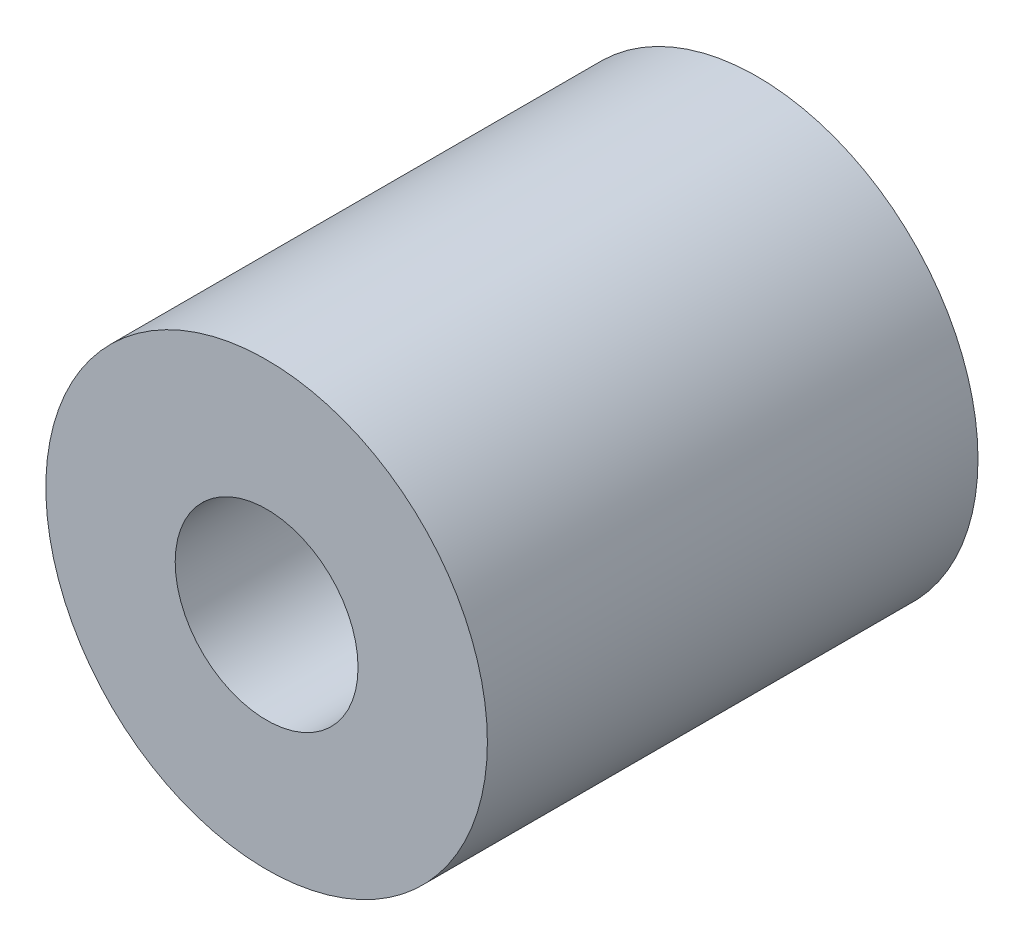
ISO-10303-21;
HEADER;
FILE_DESCRIPTION(('STEP AP214'),'2;1');
FILE_NAME('part.step','',(''),(''),'','','');
FILE_SCHEMA(('AUTOMOTIVE_DESIGN { 1 0 10303 214 1 1 1 1 }'));
ENDSEC;
DATA;
#1=APPLICATION_CONTEXT('core data for automotive mechanical design processes');
#2=APPLICATION_PROTOCOL_DEFINITION('international standard','automotive_design',2000,#1);
#3=PRODUCT_CONTEXT('',#1,'mechanical');
#4=PRODUCT('Part','Part','',(#3));
#5=PRODUCT_RELATED_PRODUCT_CATEGORY('part','',(#4));
#6=PRODUCT_DEFINITION_FORMATION('','',#4);
#7=PRODUCT_DEFINITION_CONTEXT('part definition',#1,'design');
#8=PRODUCT_DEFINITION('design','',#6,#7);
#9=PRODUCT_DEFINITION_SHAPE('','',#8);
#10=(LENGTH_UNIT() NAMED_UNIT(*) SI_UNIT(.MILLI.,.METRE.));
#11=(NAMED_UNIT(*) PLANE_ANGLE_UNIT() SI_UNIT($,.RADIAN.));
#12=(NAMED_UNIT(*) SI_UNIT($,.STERADIAN.) SOLID_ANGLE_UNIT());
#13=UNCERTAINTY_MEASURE_WITH_UNIT(LENGTH_MEASURE(1.E-05),#10,'distance_accuracy_value','');
#14=(GEOMETRIC_REPRESENTATION_CONTEXT(3) GLOBAL_UNCERTAINTY_ASSIGNED_CONTEXT((#13)) GLOBAL_UNIT_ASSIGNED_CONTEXT((#10,
#11,#12)) REPRESENTATION_CONTEXT('',''));
#15=CARTESIAN_POINT('',(0.,0.,0.));
#16=DIRECTION('',(0.,0.,1.));
#17=DIRECTION('',(1.,0.,0.));
#18=AXIS2_PLACEMENT_3D('',#15,#16,#17);
#19=CARTESIAN_POINT('',(0.,0.,11.));
#20=DIRECTION('',(0.,0.,1.));
#21=DIRECTION('',(1.,0.,0.));
#22=AXIS2_PLACEMENT_3D('',#19,#20,#21);
#23=PLANE('',#22);
#24=CARTESIAN_POINT('',(0.,0.,11.));
#25=DIRECTION('',(0.,0.,1.));
#26=DIRECTION('',(1.,0.,0.));
#27=AXIS2_PLACEMENT_3D('',#24,#25,#26);
#28=CIRCLE('',#27,4.95);
#29=CARTESIAN_POINT('',(4.95,0.,11.));
#30=VERTEX_POINT('',#29);
#31=EDGE_CURVE('E10',#30,#30,#28,.T.);
#32=ORIENTED_EDGE('',*,*,#31,.T.);
#33=EDGE_LOOP('',(#32));
#34=FACE_BOUND('',#33,.T.);
#35=CARTESIAN_POINT('',(0.,0.,11.));
#36=DIRECTION('',(0.,0.,1.));
#37=DIRECTION('',(1.,0.,0.));
#38=AXIS2_PLACEMENT_3D('',#35,#36,#37);
#39=CIRCLE('',#38,2.05);
#40=CARTESIAN_POINT('',(2.05,0.,11.));
#41=VERTEX_POINT('',#40);
#42=EDGE_CURVE('E42',#41,#41,#39,.T.);
#43=ORIENTED_EDGE('',*,*,#42,.F.);
#44=EDGE_LOOP('',(#43));
#45=FACE_BOUND('',#44,.T.);
#46=ADVANCED_FACE('F31',(#34,#45),#23,.T.);
#47=CARTESIAN_POINT('',(0.,0.,0.));
#48=DIRECTION('',(0.,0.,1.));
#49=DIRECTION('',(1.,0.,0.));
#50=AXIS2_PLACEMENT_3D('',#47,#48,#49);
#51=PLANE('',#50);
#52=CARTESIAN_POINT('',(0.,0.,0.));
#53=DIRECTION('',(0.,0.,1.));
#54=DIRECTION('',(1.,0.,0.));
#55=AXIS2_PLACEMENT_3D('',#52,#53,#54);
#56=CIRCLE('',#55,4.95);
#57=CARTESIAN_POINT('',(4.95,0.,0.));
#58=VERTEX_POINT('',#57);
#59=EDGE_CURVE('E35',#58,#58,#56,.T.);
#60=ORIENTED_EDGE('',*,*,#59,.F.);
#61=EDGE_LOOP('',(#60));
#62=FACE_BOUND('',#61,.T.);
#63=CARTESIAN_POINT('',(0.,0.,0.));
#64=DIRECTION('',(0.,0.,1.));
#65=DIRECTION('',(1.,0.,0.));
#66=AXIS2_PLACEMENT_3D('',#63,#64,#65);
#67=CIRCLE('',#66,2.05);
#68=CARTESIAN_POINT('',(2.05,0.,0.));
#69=VERTEX_POINT('',#68);
#70=EDGE_CURVE('E44',#69,#69,#67,.T.);
#71=ORIENTED_EDGE('',*,*,#70,.T.);
#72=EDGE_LOOP('',(#71));
#73=FACE_BOUND('',#72,.T.);
#74=ADVANCED_FACE('F54',(#62,#73),#51,.F.);
#75=CARTESIAN_POINT('',(0.,0.,11.));
#76=DIRECTION('',(0.,0.,-1.));
#77=DIRECTION('',(-1.,0.,0.));
#78=AXIS2_PLACEMENT_3D('',#75,#76,#77);
#79=CYLINDRICAL_SURFACE('',#78,4.95);
#80=ORIENTED_EDGE('',*,*,#31,.F.);
#81=EDGE_LOOP('',(#80));
#82=FACE_BOUND('',#81,.T.);
#83=ORIENTED_EDGE('',*,*,#59,.T.);
#84=EDGE_LOOP('',(#83));
#85=FACE_BOUND('',#84,.T.);
#86=ADVANCED_FACE('F33',(#82,#85),#79,.T.);
#87=CARTESIAN_POINT('',(0.,0.,11.));
#88=DIRECTION('',(0.,0.,-1.));
#89=DIRECTION('',(-1.,0.,0.));
#90=AXIS2_PLACEMENT_3D('',#87,#88,#89);
#91=CYLINDRICAL_SURFACE('',#90,2.05);
#92=ORIENTED_EDGE('',*,*,#42,.T.);
#93=EDGE_LOOP('',(#92));
#94=FACE_BOUND('',#93,.T.);
#95=ORIENTED_EDGE('',*,*,#70,.F.);
#96=EDGE_LOOP('',(#95));
#97=FACE_BOUND('',#96,.T.);
#98=ADVANCED_FACE('F50',(#94,#97),#91,.F.);
#99=CLOSED_SHELL('',(#46,#74,#86,#98));
#100=MANIFOLD_SOLID_BREP('B2',#99);
#101=ADVANCED_BREP_SHAPE_REPRESENTATION('',(#18,#100),#14);
#102=SHAPE_DEFINITION_REPRESENTATION(#9,#101);
ENDSEC;
END-ISO-10303-21;
